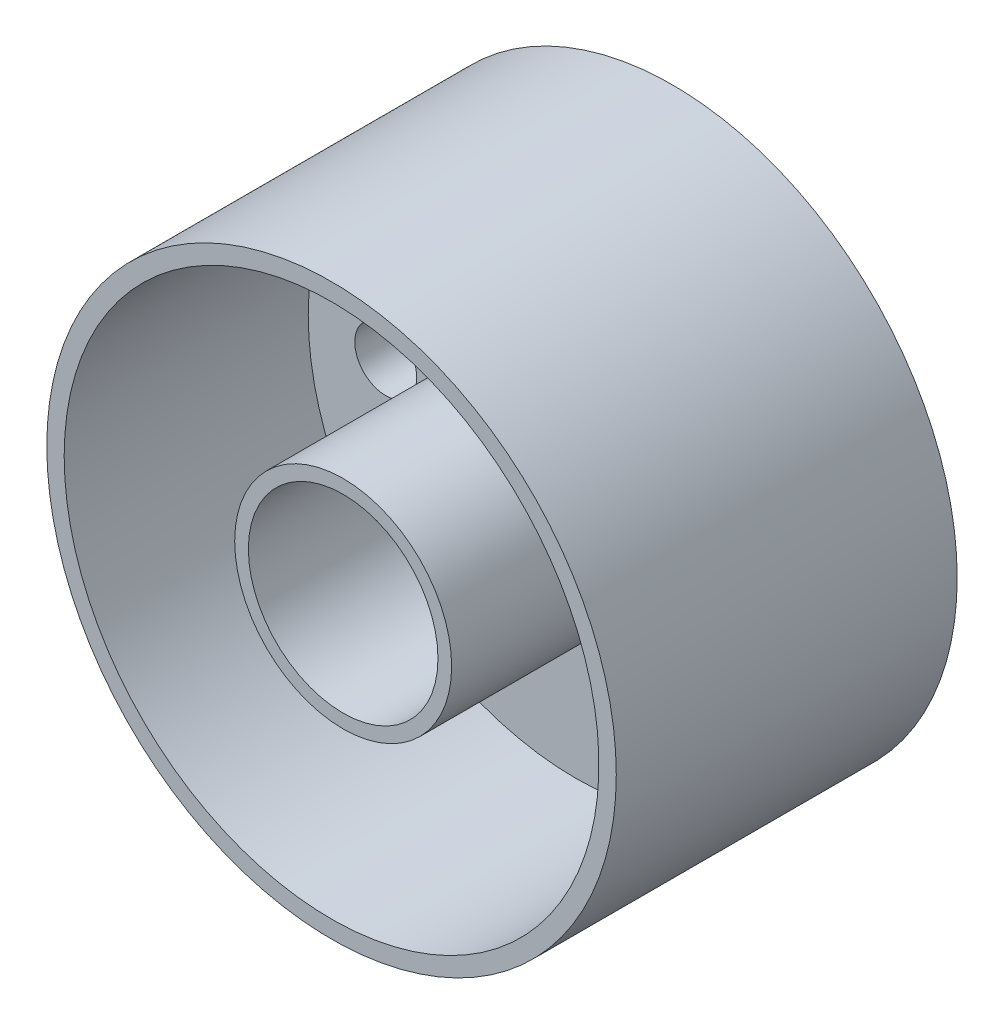
ISO-10303-21;
HEADER;
FILE_DESCRIPTION(('STEP AP214'),'2;1');
FILE_NAME('part.step','',(''),(''),'','','');
FILE_SCHEMA(('AUTOMOTIVE_DESIGN { 1 0 10303 214 1 1 1 1 }'));
ENDSEC;
DATA;
#1=APPLICATION_CONTEXT('core data for automotive mechanical design processes');
#2=APPLICATION_PROTOCOL_DEFINITION('international standard','automotive_design',2000,#1);
#3=PRODUCT_CONTEXT('',#1,'mechanical');
#4=PRODUCT('Part','Part','',(#3));
#5=PRODUCT_RELATED_PRODUCT_CATEGORY('part','',(#4));
#6=PRODUCT_DEFINITION_FORMATION('','',#4);
#7=PRODUCT_DEFINITION_CONTEXT('part definition',#1,'design');
#8=PRODUCT_DEFINITION('design','',#6,#7);
#9=PRODUCT_DEFINITION_SHAPE('','',#8);
#10=(LENGTH_UNIT() NAMED_UNIT(*) SI_UNIT(.MILLI.,.METRE.));
#11=(NAMED_UNIT(*) PLANE_ANGLE_UNIT() SI_UNIT($,.RADIAN.));
#12=(NAMED_UNIT(*) SI_UNIT($,.STERADIAN.) SOLID_ANGLE_UNIT());
#13=UNCERTAINTY_MEASURE_WITH_UNIT(LENGTH_MEASURE(1.E-05),#10,'distance_accuracy_value','');
#14=(GEOMETRIC_REPRESENTATION_CONTEXT(3) GLOBAL_UNCERTAINTY_ASSIGNED_CONTEXT((#13)) GLOBAL_UNIT_ASSIGNED_CONTEXT((#10,
#11,#12)) REPRESENTATION_CONTEXT('',''));
#15=CARTESIAN_POINT('',(0.,0.,0.));
#16=DIRECTION('',(0.,0.,1.));
#17=DIRECTION('',(1.,0.,0.));
#18=AXIS2_PLACEMENT_3D('',#15,#16,#17);
#19=CARTESIAN_POINT('',(0.,0.,1.6));
#20=DIRECTION('',(0.,0.,1.));
#21=DIRECTION('',(1.,0.,0.));
#22=AXIS2_PLACEMENT_3D('',#19,#20,#21);
#23=PLANE('',#22);
#24=CARTESIAN_POINT('',(-2.45000000000005,-4.24352447854372,1.6));
#25=DIRECTION('',(0.,0.,1.));
#26=DIRECTION('',(1.,0.,0.));
#27=AXIS2_PLACEMENT_3D('',#24,#25,#26);
#28=CIRCLE('',#27,0.800000000000001);
#29=CARTESIAN_POINT('',(-1.65000000000005,-4.24352447854372,1.6));
#30=VERTEX_POINT('',#29);
#31=EDGE_CURVE('E73',#30,#30,#28,.T.);
#32=ORIENTED_EDGE('',*,*,#31,.F.);
#33=EDGE_LOOP('',(#32));
#34=FACE_BOUND('',#33,.T.);
#35=CARTESIAN_POINT('',(4.9,0.,1.6));
#36=DIRECTION('',(0.,0.,1.));
#37=DIRECTION('',(1.,0.,0.));
#38=AXIS2_PLACEMENT_3D('',#35,#36,#37);
#39=CIRCLE('',#38,0.800000000000001);
#40=CARTESIAN_POINT('',(5.7,0.,1.6));
#41=VERTEX_POINT('',#40);
#42=EDGE_CURVE('E61',#41,#41,#39,.T.);
#43=ORIENTED_EDGE('',*,*,#42,.F.);
#44=EDGE_LOOP('',(#43));
#45=FACE_BOUND('',#44,.T.);
#46=CARTESIAN_POINT('',(-2.44999999999999,4.24352447854376,1.6));
#47=DIRECTION('',(0.,0.,1.));
#48=DIRECTION('',(1.,0.,0.));
#49=AXIS2_PLACEMENT_3D('',#46,#47,#48);
#50=CIRCLE('',#49,0.800000000000001);
#51=CARTESIAN_POINT('',(-1.64999999999999,4.24352447854376,1.6));
#52=VERTEX_POINT('',#51);
#53=EDGE_CURVE('E50',#52,#52,#50,.T.);
#54=ORIENTED_EDGE('',*,*,#53,.F.);
#55=EDGE_LOOP('',(#54));
#56=FACE_BOUND('',#55,.T.);
#57=CARTESIAN_POINT('',(-4.9,0.,1.6));
#58=DIRECTION('',(0.,0.,1.));
#59=DIRECTION('',(1.,0.,0.));
#60=AXIS2_PLACEMENT_3D('',#57,#58,#59);
#61=CIRCLE('',#60,0.800000000000001);
#62=CARTESIAN_POINT('',(-4.1,0.,1.6));
#63=VERTEX_POINT('',#62);
#64=EDGE_CURVE('E42',#63,#63,#61,.T.);
#65=ORIENTED_EDGE('',*,*,#64,.F.);
#66=EDGE_LOOP('',(#65));
#67=FACE_BOUND('',#66,.T.);
#68=CARTESIAN_POINT('',(2.45000000000002,4.24352447854374,1.6));
#69=DIRECTION('',(0.,0.,1.));
#70=DIRECTION('',(1.,0.,0.));
#71=AXIS2_PLACEMENT_3D('',#68,#69,#70);
#72=CIRCLE('',#71,0.800000000000001);
#73=CARTESIAN_POINT('',(3.25000000000002,4.24352447854374,1.6));
#74=VERTEX_POINT('',#73);
#75=EDGE_CURVE('E55',#74,#74,#72,.T.);
#76=ORIENTED_EDGE('',*,*,#75,.F.);
#77=EDGE_LOOP('',(#76));
#78=FACE_BOUND('',#77,.T.);
#79=CARTESIAN_POINT('',(2.44999999999996,-4.24352447854377,1.6));
#80=DIRECTION('',(0.,0.,1.));
#81=DIRECTION('',(1.,0.,0.));
#82=AXIS2_PLACEMENT_3D('',#79,#80,#81);
#83=CIRCLE('',#82,0.800000000000001);
#84=CARTESIAN_POINT('',(3.24999999999996,-4.24352447854377,1.6));
#85=VERTEX_POINT('',#84);
#86=EDGE_CURVE('E67',#85,#85,#83,.T.);
#87=ORIENTED_EDGE('',*,*,#86,.F.);
#88=EDGE_LOOP('',(#87));
#89=FACE_BOUND('',#88,.T.);
#90=CARTESIAN_POINT('',(0.,0.,1.6));
#91=DIRECTION('',(0.,0.,1.));
#92=DIRECTION('',(1.,0.,0.));
#93=AXIS2_PLACEMENT_3D('',#90,#91,#92);
#94=CIRCLE('',#93,2.8);
#95=CARTESIAN_POINT('',(2.8,0.,1.6));
#96=VERTEX_POINT('',#95);
#97=EDGE_CURVE('E85',#96,#96,#94,.T.);
#98=ORIENTED_EDGE('',*,*,#97,.F.);
#99=EDGE_LOOP('',(#98));
#100=FACE_BOUND('',#99,.T.);
#101=CARTESIAN_POINT('',(0.,0.,1.6));
#102=DIRECTION('',(0.,0.,1.));
#103=DIRECTION('',(1.,0.,0.));
#104=AXIS2_PLACEMENT_3D('',#101,#102,#103);
#105=CIRCLE('',#104,6.90159336650028);
#106=CARTESIAN_POINT('',(6.90159336650028,0.,1.6));
#107=VERTEX_POINT('',#106);
#108=EDGE_CURVE('E94',#107,#107,#105,.T.);
#109=ORIENTED_EDGE('',*,*,#108,.T.);
#110=EDGE_LOOP('',(#109));
#111=FACE_BOUND('',#110,.T.);
#112=ADVANCED_FACE('F31',(#34,#45,#56,#67,#78,#89,#100,#111),#23,.T.);
#113=CARTESIAN_POINT('',(0.,0.,0.));
#114=DIRECTION('',(0.,0.,1.));
#115=DIRECTION('',(1.,0.,0.));
#116=AXIS2_PLACEMENT_3D('',#113,#114,#115);
#117=PLANE('',#116);
#118=CARTESIAN_POINT('',(-2.45000000000005,-4.24352447854372,0.));
#119=DIRECTION('',(0.,0.,1.));
#120=DIRECTION('',(1.,0.,0.));
#121=AXIS2_PLACEMENT_3D('',#118,#119,#120);
#122=CIRCLE('',#121,0.800000000000001);
#123=CARTESIAN_POINT('',(-1.65000000000005,-4.24352447854372,0.));
#124=VERTEX_POINT('',#123);
#125=EDGE_CURVE('E76',#124,#124,#122,.T.);
#126=ORIENTED_EDGE('',*,*,#125,.T.);
#127=EDGE_LOOP('',(#126));
#128=FACE_BOUND('',#127,.T.);
#129=CARTESIAN_POINT('',(2.44999999999996,-4.24352447854377,0.));
#130=DIRECTION('',(0.,0.,1.));
#131=DIRECTION('',(1.,0.,0.));
#132=AXIS2_PLACEMENT_3D('',#129,#130,#131);
#133=CIRCLE('',#132,0.800000000000001);
#134=CARTESIAN_POINT('',(3.24999999999996,-4.24352447854377,0.));
#135=VERTEX_POINT('',#134);
#136=EDGE_CURVE('E70',#135,#135,#133,.T.);
#137=ORIENTED_EDGE('',*,*,#136,.T.);
#138=EDGE_LOOP('',(#137));
#139=FACE_BOUND('',#138,.T.);
#140=CARTESIAN_POINT('',(4.9,0.,0.));
#141=DIRECTION('',(0.,0.,1.));
#142=DIRECTION('',(1.,0.,0.));
#143=AXIS2_PLACEMENT_3D('',#140,#141,#142);
#144=CIRCLE('',#143,0.800000000000001);
#145=CARTESIAN_POINT('',(5.7,0.,0.));
#146=VERTEX_POINT('',#145);
#147=EDGE_CURVE('E64',#146,#146,#144,.T.);
#148=ORIENTED_EDGE('',*,*,#147,.T.);
#149=EDGE_LOOP('',(#148));
#150=FACE_BOUND('',#149,.T.);
#151=CARTESIAN_POINT('',(2.45000000000002,4.24352447854374,0.));
#152=DIRECTION('',(0.,0.,1.));
#153=DIRECTION('',(1.,0.,0.));
#154=AXIS2_PLACEMENT_3D('',#151,#152,#153);
#155=CIRCLE('',#154,0.800000000000001);
#156=CARTESIAN_POINT('',(3.25000000000002,4.24352447854374,0.));
#157=VERTEX_POINT('',#156);
#158=EDGE_CURVE('E58',#157,#157,#155,.T.);
#159=ORIENTED_EDGE('',*,*,#158,.T.);
#160=EDGE_LOOP('',(#159));
#161=FACE_BOUND('',#160,.T.);
#162=CARTESIAN_POINT('',(-2.44999999999999,4.24352447854376,0.));
#163=DIRECTION('',(0.,0.,1.));
#164=DIRECTION('',(1.,0.,0.));
#165=AXIS2_PLACEMENT_3D('',#162,#163,#164);
#166=CIRCLE('',#165,0.800000000000001);
#167=CARTESIAN_POINT('',(-1.64999999999999,4.24352447854376,0.));
#168=VERTEX_POINT('',#167);
#169=EDGE_CURVE('E52',#168,#168,#166,.T.);
#170=ORIENTED_EDGE('',*,*,#169,.T.);
#171=EDGE_LOOP('',(#170));
#172=FACE_BOUND('',#171,.T.);
#173=CARTESIAN_POINT('',(-4.9,0.,0.));
#174=DIRECTION('',(0.,0.,1.));
#175=DIRECTION('',(1.,0.,0.));
#176=AXIS2_PLACEMENT_3D('',#173,#174,#175);
#177=CIRCLE('',#176,0.800000000000001);
#178=CARTESIAN_POINT('',(-4.1,0.,0.));
#179=VERTEX_POINT('',#178);
#180=EDGE_CURVE('E46',#179,#179,#177,.T.);
#181=ORIENTED_EDGE('',*,*,#180,.T.);
#182=EDGE_LOOP('',(#181));
#183=FACE_BOUND('',#182,.T.);
#184=CARTESIAN_POINT('',(0.,0.,0.));
#185=DIRECTION('',(0.,0.,1.));
#186=DIRECTION('',(1.,0.,0.));
#187=AXIS2_PLACEMENT_3D('',#184,#185,#186);
#188=CIRCLE('',#187,2.45);
#189=CARTESIAN_POINT('',(2.45,0.,0.));
#190=VERTEX_POINT('',#189);
#191=EDGE_CURVE('E38',#190,#190,#188,.T.);
#192=ORIENTED_EDGE('',*,*,#191,.T.);
#193=EDGE_LOOP('',(#192));
#194=FACE_BOUND('',#193,.T.);
#195=CARTESIAN_POINT('',(0.,0.,0.));
#196=DIRECTION('',(0.,0.,1.));
#197=DIRECTION('',(1.,0.,0.));
#198=AXIS2_PLACEMENT_3D('',#195,#196,#197);
#199=CIRCLE('',#198,6.90159336650028);
#200=CARTESIAN_POINT('',(6.90159336650028,0.,0.));
#201=VERTEX_POINT('',#200);
#202=EDGE_CURVE('E10',#201,#201,#199,.T.);
#203=ORIENTED_EDGE('',*,*,#202,.F.);
#204=EDGE_LOOP('',(#203));
#205=FACE_BOUND('',#204,.T.);
#206=ADVANCED_FACE('F129',(#128,#139,#150,#161,#172,#183,#194,#205),#117,.F.);
#207=CARTESIAN_POINT('',(0.,0.,1.6));
#208=DIRECTION('',(0.,0.,-1.));
#209=DIRECTION('',(-1.,0.,0.));
#210=AXIS2_PLACEMENT_3D('',#207,#208,#209);
#211=CYLINDRICAL_SURFACE('',#210,2.45);
#212=CARTESIAN_POINT('',(0.,0.,1.6));
#213=DIRECTION('',(0.,0.,1.));
#214=DIRECTION('',(1.,0.,0.));
#215=AXIS2_PLACEMENT_3D('',#212,#213,#214);
#216=CIRCLE('',#215,2.45);
#217=CARTESIAN_POINT('',(2.45,0.,1.6));
#218=VERTEX_POINT('',#217);
#219=EDGE_CURVE('E79',#218,#218,#216,.T.);
#220=ORIENTED_EDGE('',*,*,#219,.T.);
#221=EDGE_LOOP('',(#220));
#222=FACE_BOUND('',#221,.T.);
#223=ORIENTED_EDGE('',*,*,#191,.F.);
#224=EDGE_LOOP('',(#223));
#225=FACE_BOUND('',#224,.T.);
#226=ADVANCED_FACE('F135',(#222,#225),#211,.F.);
#227=CARTESIAN_POINT('',(-4.9,0.,1.6));
#228=DIRECTION('',(0.,0.,-1.));
#229=DIRECTION('',(-1.,0.,0.));
#230=AXIS2_PLACEMENT_3D('',#227,#228,#229);
#231=CYLINDRICAL_SURFACE('',#230,0.800000000000001);
#232=ORIENTED_EDGE('',*,*,#64,.T.);
#233=EDGE_LOOP('',(#232));
#234=FACE_BOUND('',#233,.T.);
#235=ORIENTED_EDGE('',*,*,#180,.F.);
#236=EDGE_LOOP('',(#235));
#237=FACE_BOUND('',#236,.T.);
#238=ADVANCED_FACE('F142',(#234,#237),#231,.F.);
#239=CARTESIAN_POINT('',(-2.44999999999999,4.24352447854376,1.6));
#240=DIRECTION('',(0.,0.,-1.));
#241=DIRECTION('',(-1.,0.,0.));
#242=AXIS2_PLACEMENT_3D('',#239,#240,#241);
#243=CYLINDRICAL_SURFACE('',#242,0.800000000000001);
#244=ORIENTED_EDGE('',*,*,#53,.T.);
#245=EDGE_LOOP('',(#244));
#246=FACE_BOUND('',#245,.T.);
#247=ORIENTED_EDGE('',*,*,#169,.F.);
#248=EDGE_LOOP('',(#247));
#249=FACE_BOUND('',#248,.T.);
#250=ADVANCED_FACE('F146',(#246,#249),#243,.F.);
#251=CARTESIAN_POINT('',(2.45000000000002,4.24352447854374,1.6));
#252=DIRECTION('',(0.,0.,-1.));
#253=DIRECTION('',(-1.,0.,0.));
#254=AXIS2_PLACEMENT_3D('',#251,#252,#253);
#255=CYLINDRICAL_SURFACE('',#254,0.800000000000001);
#256=ORIENTED_EDGE('',*,*,#75,.T.);
#257=EDGE_LOOP('',(#256));
#258=FACE_BOUND('',#257,.T.);
#259=ORIENTED_EDGE('',*,*,#158,.F.);
#260=EDGE_LOOP('',(#259));
#261=FACE_BOUND('',#260,.T.);
#262=ADVANCED_FACE('F150',(#258,#261),#255,.F.);
#263=CARTESIAN_POINT('',(4.9,0.,1.6));
#264=DIRECTION('',(0.,0.,-1.));
#265=DIRECTION('',(-1.,0.,0.));
#266=AXIS2_PLACEMENT_3D('',#263,#264,#265);
#267=CYLINDRICAL_SURFACE('',#266,0.800000000000001);
#268=ORIENTED_EDGE('',*,*,#42,.T.);
#269=EDGE_LOOP('',(#268));
#270=FACE_BOUND('',#269,.T.);
#271=ORIENTED_EDGE('',*,*,#147,.F.);
#272=EDGE_LOOP('',(#271));
#273=FACE_BOUND('',#272,.T.);
#274=ADVANCED_FACE('F154',(#270,#273),#267,.F.);
#275=CARTESIAN_POINT('',(2.44999999999996,-4.24352447854377,1.6));
#276=DIRECTION('',(0.,0.,-1.));
#277=DIRECTION('',(-1.,0.,0.));
#278=AXIS2_PLACEMENT_3D('',#275,#276,#277);
#279=CYLINDRICAL_SURFACE('',#278,0.800000000000001);
#280=ORIENTED_EDGE('',*,*,#86,.T.);
#281=EDGE_LOOP('',(#280));
#282=FACE_BOUND('',#281,.T.);
#283=ORIENTED_EDGE('',*,*,#136,.F.);
#284=EDGE_LOOP('',(#283));
#285=FACE_BOUND('',#284,.T.);
#286=ADVANCED_FACE('F158',(#282,#285),#279,.F.);
#287=CARTESIAN_POINT('',(-2.45000000000005,-4.24352447854372,1.6));
#288=DIRECTION('',(0.,0.,-1.));
#289=DIRECTION('',(-1.,0.,0.));
#290=AXIS2_PLACEMENT_3D('',#287,#288,#289);
#291=CYLINDRICAL_SURFACE('',#290,0.800000000000001);
#292=ORIENTED_EDGE('',*,*,#31,.T.);
#293=EDGE_LOOP('',(#292));
#294=FACE_BOUND('',#293,.T.);
#295=ORIENTED_EDGE('',*,*,#125,.F.);
#296=EDGE_LOOP('',(#295));
#297=FACE_BOUND('',#296,.T.);
#298=ADVANCED_FACE('F162',(#294,#297),#291,.F.);
#299=CARTESIAN_POINT('',(0.,0.,1.6));
#300=DIRECTION('',(0.,0.,1.));
#301=DIRECTION('',(1.,0.,0.));
#302=AXIS2_PLACEMENT_3D('',#299,#300,#301);
#303=PLANE('',#302);
#304=CARTESIAN_POINT('',(0.,0.,1.6));
#305=DIRECTION('',(0.,0.,1.));
#306=DIRECTION('',(1.,0.,0.));
#307=AXIS2_PLACEMENT_3D('',#304,#305,#306);
#308=CIRCLE('',#307,2.44726597844888);
#309=CARTESIAN_POINT('',(2.44726597844888,0.,1.6));
#310=VERTEX_POINT('',#309);
#311=EDGE_CURVE('E91',#310,#310,#308,.T.);
#312=ORIENTED_EDGE('',*,*,#311,.T.);
#313=EDGE_LOOP('',(#312));
#314=FACE_BOUND('',#313,.T.);
#315=ORIENTED_EDGE('',*,*,#219,.F.);
#316=EDGE_LOOP('',(#315));
#317=FACE_BOUND('',#316,.T.);
#318=ADVANCED_FACE('F166',(#314,#317),#303,.F.);
#319=CARTESIAN_POINT('',(0.,0.,7.6));
#320=DIRECTION('',(0.,0.,1.));
#321=DIRECTION('',(1.,0.,0.));
#322=AXIS2_PLACEMENT_3D('',#319,#320,#321);
#323=PLANE('',#322);
#324=CARTESIAN_POINT('',(0.,0.,7.6));
#325=DIRECTION('',(0.,0.,1.));
#326=DIRECTION('',(1.,0.,0.));
#327=AXIS2_PLACEMENT_3D('',#324,#325,#326);
#328=CIRCLE('',#327,2.8);
#329=CARTESIAN_POINT('',(2.8,0.,7.6));
#330=VERTEX_POINT('',#329);
#331=EDGE_CURVE('E84',#330,#330,#328,.T.);
#332=ORIENTED_EDGE('',*,*,#331,.T.);
#333=EDGE_LOOP('',(#332));
#334=FACE_BOUND('',#333,.T.);
#335=CARTESIAN_POINT('',(0.,0.,7.6));
#336=DIRECTION('',(0.,0.,1.));
#337=DIRECTION('',(1.,0.,0.));
#338=AXIS2_PLACEMENT_3D('',#335,#336,#337);
#339=CIRCLE('',#338,2.44726597844888);
#340=CARTESIAN_POINT('',(2.44726597844888,0.,7.6));
#341=VERTEX_POINT('',#340);
#342=EDGE_CURVE('E88',#341,#341,#339,.T.);
#343=ORIENTED_EDGE('',*,*,#342,.F.);
#344=EDGE_LOOP('',(#343));
#345=FACE_BOUND('',#344,.T.);
#346=ADVANCED_FACE('F170',(#334,#345),#323,.T.);
#347=CARTESIAN_POINT('',(0.,0.,7.6));
#348=DIRECTION('',(0.,0.,-1.));
#349=DIRECTION('',(-1.,0.,0.));
#350=AXIS2_PLACEMENT_3D('',#347,#348,#349);
#351=CYLINDRICAL_SURFACE('',#350,2.8);
#352=ORIENTED_EDGE('',*,*,#331,.F.);
#353=EDGE_LOOP('',(#352));
#354=FACE_BOUND('',#353,.T.);
#355=ORIENTED_EDGE('',*,*,#97,.T.);
#356=EDGE_LOOP('',(#355));
#357=FACE_BOUND('',#356,.T.);
#358=ADVANCED_FACE('F125',(#354,#357),#351,.T.);
#359=CARTESIAN_POINT('',(0.,0.,7.6));
#360=DIRECTION('',(0.,0.,-1.));
#361=DIRECTION('',(-1.,0.,0.));
#362=AXIS2_PLACEMENT_3D('',#359,#360,#361);
#363=CYLINDRICAL_SURFACE('',#362,2.44726597844888);
#364=ORIENTED_EDGE('',*,*,#342,.T.);
#365=EDGE_LOOP('',(#364));
#366=FACE_BOUND('',#365,.T.);
#367=ORIENTED_EDGE('',*,*,#311,.F.);
#368=EDGE_LOOP('',(#367));
#369=FACE_BOUND('',#368,.T.);
#370=ADVANCED_FACE('F116',(#366,#369),#363,.F.);
#371=CARTESIAN_POINT('',(0.,0.,-0.900000000000001));
#372=DIRECTION('',(0.,0.,-1.));
#373=DIRECTION('',(-1.,0.,0.));
#374=AXIS2_PLACEMENT_3D('',#371,#372,#373);
#375=PLANE('',#374);
#376=CARTESIAN_POINT('',(0.,0.,-0.900000000000001));
#377=DIRECTION('',(0.,0.,-1.));
#378=DIRECTION('',(-1.,0.,0.));
#379=AXIS2_PLACEMENT_3D('',#376,#377,#378);
#380=CIRCLE('',#379,7.35);
#381=CARTESIAN_POINT('',(-7.35,0.,-0.900000000000001));
#382=VERTEX_POINT('',#381);
#383=EDGE_CURVE('E105',#382,#382,#380,.T.);
#384=ORIENTED_EDGE('',*,*,#383,.T.);
#385=EDGE_LOOP('',(#384));
#386=FACE_BOUND('',#385,.T.);
#387=CARTESIAN_POINT('',(0.,0.,-0.900000000000001));
#388=DIRECTION('',(0.,0.,-1.));
#389=DIRECTION('',(-1.,0.,0.));
#390=AXIS2_PLACEMENT_3D('',#387,#388,#389);
#391=CIRCLE('',#390,6.90159336650028);
#392=CARTESIAN_POINT('',(-6.90159336650028,0.,-0.900000000000001));
#393=VERTEX_POINT('',#392);
#394=EDGE_CURVE('E108',#393,#393,#391,.T.);
#395=ORIENTED_EDGE('',*,*,#394,.F.);
#396=EDGE_LOOP('',(#395));
#397=FACE_BOUND('',#396,.T.);
#398=ADVANCED_FACE('F114',(#386,#397),#375,.T.);
#399=CARTESIAN_POINT('',(0.,0.,7.9));
#400=DIRECTION('',(0.,0.,-1.));
#401=DIRECTION('',(-1.,0.,0.));
#402=AXIS2_PLACEMENT_3D('',#399,#400,#401);
#403=CYLINDRICAL_SURFACE('',#402,6.90159336650028);
#404=ORIENTED_EDGE('',*,*,#394,.T.);
#405=EDGE_LOOP('',(#404));
#406=FACE_BOUND('',#405,.T.);
#407=ORIENTED_EDGE('',*,*,#202,.T.);
#408=EDGE_LOOP('',(#407));
#409=FACE_BOUND('',#408,.T.);
#410=ADVANCED_FACE('F112',(#406,#409),#403,.F.);
#411=CARTESIAN_POINT('',(0.,0.,1.6));
#412=DIRECTION('',(0.,0.,-1.));
#413=DIRECTION('',(-1.,0.,0.));
#414=AXIS2_PLACEMENT_3D('',#411,#412,#413);
#415=CYLINDRICAL_SURFACE('',#414,7.35);
#416=ORIENTED_EDGE('',*,*,#383,.F.);
#417=EDGE_LOOP('',(#416));
#418=FACE_BOUND('',#417,.T.);
#419=CARTESIAN_POINT('',(0.,0.,7.9));
#420=DIRECTION('',(0.,0.,-1.));
#421=DIRECTION('',(-1.,0.,0.));
#422=AXIS2_PLACEMENT_3D('',#419,#420,#421);
#423=CIRCLE('',#422,7.35);
#424=CARTESIAN_POINT('',(-7.35,0.,7.9));
#425=VERTEX_POINT('',#424);
#426=EDGE_CURVE('E99',#425,#425,#423,.T.);
#427=ORIENTED_EDGE('',*,*,#426,.T.);
#428=EDGE_LOOP('',(#427));
#429=FACE_BOUND('',#428,.T.);
#430=ADVANCED_FACE('F33',(#418,#429),#415,.T.);
#431=CARTESIAN_POINT('',(0.,0.,7.9));
#432=DIRECTION('',(0.,0.,-1.));
#433=DIRECTION('',(-1.,0.,0.));
#434=AXIS2_PLACEMENT_3D('',#431,#432,#433);
#435=PLANE('',#434);
#436=CARTESIAN_POINT('',(0.,0.,7.9));
#437=DIRECTION('',(0.,0.,-1.));
#438=DIRECTION('',(-1.,0.,0.));
#439=AXIS2_PLACEMENT_3D('',#436,#437,#438);
#440=CIRCLE('',#439,6.90159336650028);
#441=CARTESIAN_POINT('',(-6.90159336650028,0.,7.9));
#442=VERTEX_POINT('',#441);
#443=EDGE_CURVE('E102',#442,#442,#440,.T.);
#444=ORIENTED_EDGE('',*,*,#443,.T.);
#445=EDGE_LOOP('',(#444));
#446=FACE_BOUND('',#445,.T.);
#447=ORIENTED_EDGE('',*,*,#426,.F.);
#448=EDGE_LOOP('',(#447));
#449=FACE_BOUND('',#448,.T.);
#450=ADVANCED_FACE('F178',(#446,#449),#435,.F.);
#451=ORIENTED_EDGE('',*,*,#108,.F.);
#452=EDGE_LOOP('',(#451));
#453=FACE_BOUND('',#452,.T.);
#454=ORIENTED_EDGE('',*,*,#443,.F.);
#455=EDGE_LOOP('',(#454));
#456=FACE_BOUND('',#455,.T.);
#457=ADVANCED_FACE('F124',(#453,#456),#403,.F.);
#458=CLOSED_SHELL('',(#112,#206,#226,#238,#250,#262,#274,#286,#298,#318,#346,#358,#370,#398,
#410,#430,#450,#457));
#459=MANIFOLD_SOLID_BREP('B2',#458);
#460=ADVANCED_BREP_SHAPE_REPRESENTATION('',(#18,#459),#14);
#461=SHAPE_DEFINITION_REPRESENTATION(#9,#460);
ENDSEC;
END-ISO-10303-21;
